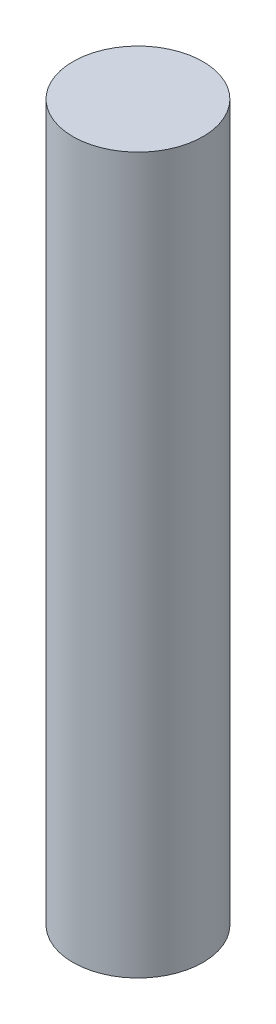
ISO-10303-21;
HEADER;
FILE_DESCRIPTION(('STEP AP214'),'2;1');
FILE_NAME('part.step','',(''),(''),'','','');
FILE_SCHEMA(('AUTOMOTIVE_DESIGN { 1 0 10303 214 1 1 1 1 }'));
ENDSEC;
DATA;
#1=APPLICATION_CONTEXT('core data for automotive mechanical design processes');
#2=APPLICATION_PROTOCOL_DEFINITION('international standard','automotive_design',2000,#1);
#3=PRODUCT_CONTEXT('',#1,'mechanical');
#4=PRODUCT('Part','Part','',(#3));
#5=PRODUCT_RELATED_PRODUCT_CATEGORY('part','',(#4));
#6=PRODUCT_DEFINITION_FORMATION('','',#4);
#7=PRODUCT_DEFINITION_CONTEXT('part definition',#1,'design');
#8=PRODUCT_DEFINITION('design','',#6,#7);
#9=PRODUCT_DEFINITION_SHAPE('','',#8);
#10=(LENGTH_UNIT() NAMED_UNIT(*) SI_UNIT(.MILLI.,.METRE.));
#11=(NAMED_UNIT(*) PLANE_ANGLE_UNIT() SI_UNIT($,.RADIAN.));
#12=(NAMED_UNIT(*) SI_UNIT($,.STERADIAN.) SOLID_ANGLE_UNIT());
#13=UNCERTAINTY_MEASURE_WITH_UNIT(LENGTH_MEASURE(1.E-05),#10,'distance_accuracy_value','');
#14=(GEOMETRIC_REPRESENTATION_CONTEXT(3) GLOBAL_UNCERTAINTY_ASSIGNED_CONTEXT((#13)) GLOBAL_UNIT_ASSIGNED_CONTEXT((#10,
#11,#12)) REPRESENTATION_CONTEXT('',''));
#15=CARTESIAN_POINT('',(0.,0.,0.));
#16=DIRECTION('',(0.,0.,1.));
#17=DIRECTION('',(1.,0.,0.));
#18=AXIS2_PLACEMENT_3D('',#15,#16,#17);
#19=CARTESIAN_POINT('',(0.,-13.,0.));
#20=DIRECTION('',(0.,1.,0.));
#21=DIRECTION('',(0.,0.,1.));
#22=AXIS2_PLACEMENT_3D('',#19,#20,#21);
#23=CYLINDRICAL_SURFACE('',#22,2.);
#24=CARTESIAN_POINT('',(0.,-13.,0.));
#25=DIRECTION('',(0.,1.,0.));
#26=DIRECTION('',(0.,0.,1.));
#27=AXIS2_PLACEMENT_3D('',#24,#25,#26);
#28=CIRCLE('',#27,2.);
#29=CARTESIAN_POINT('',(0.,-13.,2.));
#30=VERTEX_POINT('',#29);
#31=EDGE_CURVE('E10',#30,#30,#28,.T.);
#32=ORIENTED_EDGE('',*,*,#31,.T.);
#33=EDGE_LOOP('',(#32));
#34=FACE_BOUND('',#33,.T.);
#35=CARTESIAN_POINT('',(0.,9.,0.));
#36=DIRECTION('',(0.,1.,0.));
#37=DIRECTION('',(0.,0.,1.));
#38=AXIS2_PLACEMENT_3D('',#35,#36,#37);
#39=CIRCLE('',#38,2.);
#40=CARTESIAN_POINT('',(0.,9.,2.));
#41=VERTEX_POINT('',#40);
#42=EDGE_CURVE('E36',#41,#41,#39,.T.);
#43=ORIENTED_EDGE('',*,*,#42,.F.);
#44=EDGE_LOOP('',(#43));
#45=FACE_BOUND('',#44,.T.);
#46=ADVANCED_FACE('F30',(#34,#45),#23,.T.);
#47=CARTESIAN_POINT('',(0.,-13.,0.));
#48=DIRECTION('',(0.,1.,0.));
#49=DIRECTION('',(0.,0.,1.));
#50=AXIS2_PLACEMENT_3D('',#47,#48,#49);
#51=PLANE('',#50);
#52=ORIENTED_EDGE('',*,*,#31,.F.);
#53=EDGE_LOOP('',(#52));
#54=FACE_BOUND('',#53,.T.);
#55=ADVANCED_FACE('F45',(#54),#51,.F.);
#56=CARTESIAN_POINT('',(0.,9.,0.));
#57=DIRECTION('',(0.,1.,0.));
#58=DIRECTION('',(0.,0.,1.));
#59=AXIS2_PLACEMENT_3D('',#56,#57,#58);
#60=PLANE('',#59);
#61=ORIENTED_EDGE('',*,*,#42,.T.);
#62=EDGE_LOOP('',(#61));
#63=FACE_BOUND('',#62,.T.);
#64=ADVANCED_FACE('F42',(#63),#60,.T.);
#65=CLOSED_SHELL('',(#46,#55,#64));
#66=MANIFOLD_SOLID_BREP('B2',#65);
#67=ADVANCED_BREP_SHAPE_REPRESENTATION('',(#18,#66),#14);
#68=SHAPE_DEFINITION_REPRESENTATION(#9,#67);
ENDSEC;
END-ISO-10303-21;
